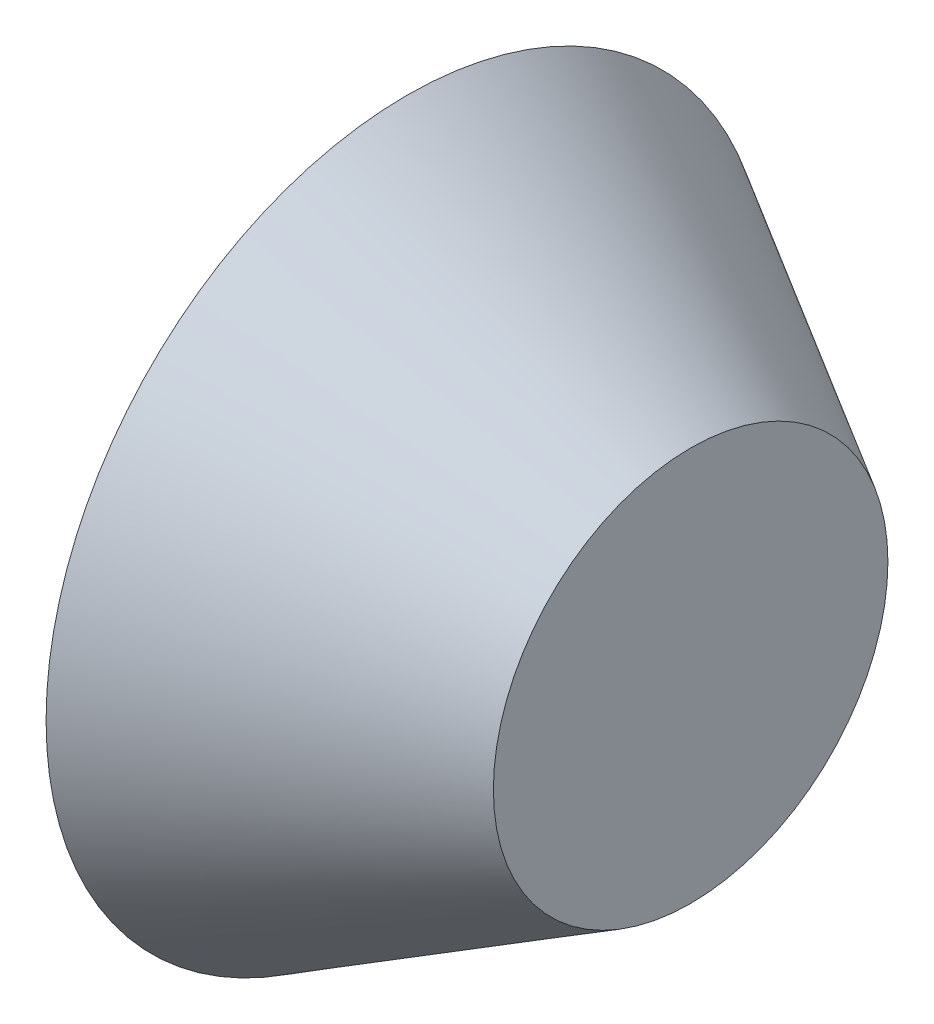
ISO-10303-21;
HEADER;
FILE_DESCRIPTION(('STEP AP214'),'2;1');
FILE_NAME('part.step','',(''),(''),'','','');
FILE_SCHEMA(('AUTOMOTIVE_DESIGN { 1 0 10303 214 1 1 1 1 }'));
ENDSEC;
DATA;
#1=APPLICATION_CONTEXT('core data for automotive mechanical design processes');
#2=APPLICATION_PROTOCOL_DEFINITION('international standard','automotive_design',2000,#1);
#3=PRODUCT_CONTEXT('',#1,'mechanical');
#4=PRODUCT('Part','Part','',(#3));
#5=PRODUCT_RELATED_PRODUCT_CATEGORY('part','',(#4));
#6=PRODUCT_DEFINITION_FORMATION('','',#4);
#7=PRODUCT_DEFINITION_CONTEXT('part definition',#1,'design');
#8=PRODUCT_DEFINITION('design','',#6,#7);
#9=PRODUCT_DEFINITION_SHAPE('','',#8);
#10=(LENGTH_UNIT() NAMED_UNIT(*) SI_UNIT(.MILLI.,.METRE.));
#11=(NAMED_UNIT(*) PLANE_ANGLE_UNIT() SI_UNIT($,.RADIAN.));
#12=(NAMED_UNIT(*) SI_UNIT($,.STERADIAN.) SOLID_ANGLE_UNIT());
#13=UNCERTAINTY_MEASURE_WITH_UNIT(LENGTH_MEASURE(1.E-05),#10,'distance_accuracy_value','');
#14=(GEOMETRIC_REPRESENTATION_CONTEXT(3) GLOBAL_UNCERTAINTY_ASSIGNED_CONTEXT((#13)) GLOBAL_UNIT_ASSIGNED_CONTEXT((#10,
#11,#12)) REPRESENTATION_CONTEXT('',''));
#15=CARTESIAN_POINT('',(0.,0.,0.));
#16=DIRECTION('',(0.,0.,1.));
#17=DIRECTION('',(1.,0.,0.));
#18=AXIS2_PLACEMENT_3D('',#15,#16,#17);
#19=CARTESIAN_POINT('',(0.110433477200222,11.1754264805429,0.));
#20=DIRECTION('',(1.,0.,0.));
#21=DIRECTION('',(0.,0.,-1.));
#22=AXIS2_PLACEMENT_3D('',#19,#20,#21);
#23=PLANE('',#22);
#24=CARTESIAN_POINT('',(0.11043347720022,0.,0.));
#25=DIRECTION('',(-1.,0.,0.));
#26=DIRECTION('',(0.,0.,1.));
#27=AXIS2_PLACEMENT_3D('',#24,#25,#26);
#28=CIRCLE('',#27,11.1754264805429);
#29=CARTESIAN_POINT('',(0.11043347720022,0.,11.1754264805429));
#30=VERTEX_POINT('',#29);
#31=EDGE_CURVE('E10',#30,#30,#28,.T.);
#32=ORIENTED_EDGE('',*,*,#31,.F.);
#33=EDGE_LOOP('',(#32));
#34=FACE_BOUND('',#33,.T.);
#35=CARTESIAN_POINT('',(0.11043347720022,0.,0.));
#36=DIRECTION('',(-1.,0.,0.));
#37=DIRECTION('',(0.,0.,1.));
#38=AXIS2_PLACEMENT_3D('',#35,#36,#37);
#39=CIRCLE('',#38,14.6395280956806);
#40=CARTESIAN_POINT('',(0.11043347720022,0.,14.6395280956806));
#41=VERTEX_POINT('',#40);
#42=EDGE_CURVE('E54',#41,#41,#39,.T.);
#43=ORIENTED_EDGE('',*,*,#42,.T.);
#44=EDGE_LOOP('',(#43));
#45=FACE_BOUND('',#44,.T.);
#46=ADVANCED_FACE('F37',(#34,#45),#23,.F.);
#47=CARTESIAN_POINT('',(0.11043347720022,0.,0.));
#48=DIRECTION('',(-1.,0.,0.));
#49=DIRECTION('',(0.,0.,1.));
#50=AXIS2_PLACEMENT_3D('',#47,#48,#49);
#51=CONICAL_SURFACE('',#50,11.1754264805429,0.523598775598292);
#52=CARTESIAN_POINT('',(8.61043347720022,0.,0.));
#53=DIRECTION('',(-1.,0.,0.));
#54=DIRECTION('',(0.,0.,1.));
#55=AXIS2_PLACEMENT_3D('',#52,#53,#54);
#56=CIRCLE('',#55,6.26794919243111);
#57=CARTESIAN_POINT('',(8.61043347720022,0.,6.26794919243111));
#58=VERTEX_POINT('',#57);
#59=EDGE_CURVE('E44',#58,#58,#56,.T.);
#60=ORIENTED_EDGE('',*,*,#59,.F.);
#61=EDGE_LOOP('',(#60));
#62=FACE_BOUND('',#61,.T.);
#63=ORIENTED_EDGE('',*,*,#31,.T.);
#64=EDGE_LOOP('',(#63));
#65=FACE_BOUND('',#64,.T.);
#66=ADVANCED_FACE('F75',(#62,#65),#51,.F.);
#67=CARTESIAN_POINT('',(8.61043347720022,0.,0.));
#68=DIRECTION('',(1.,0.,0.));
#69=DIRECTION('',(0.,0.,-1.));
#70=AXIS2_PLACEMENT_3D('',#67,#68,#69);
#71=PLANE('',#70);
#72=ORIENTED_EDGE('',*,*,#59,.T.);
#73=EDGE_LOOP('',(#72));
#74=FACE_BOUND('',#73,.T.);
#75=ADVANCED_FACE('F70',(#74),#71,.F.);
#76=CARTESIAN_POINT('',(11.6104334772002,8.,0.));
#77=DIRECTION('',(-1.,0.,0.));
#78=DIRECTION('',(0.,0.,1.));
#79=AXIS2_PLACEMENT_3D('',#76,#77,#78);
#80=PLANE('',#79);
#81=CARTESIAN_POINT('',(11.6104334772002,0.,0.));
#82=DIRECTION('',(-1.,0.,0.));
#83=DIRECTION('',(0.,0.,1.));
#84=AXIS2_PLACEMENT_3D('',#81,#82,#83);
#85=CIRCLE('',#84,8.);
#86=CARTESIAN_POINT('',(11.6104334772002,0.,8.));
#87=VERTEX_POINT('',#86);
#88=EDGE_CURVE('E49',#87,#87,#85,.T.);
#89=ORIENTED_EDGE('',*,*,#88,.F.);
#90=EDGE_LOOP('',(#89));
#91=FACE_BOUND('',#90,.T.);
#92=ADVANCED_FACE('F65',(#91),#80,.F.);
#93=CARTESIAN_POINT('',(11.6104334772002,0.,0.));
#94=DIRECTION('',(-1.,0.,0.));
#95=DIRECTION('',(0.,0.,1.));
#96=AXIS2_PLACEMENT_3D('',#93,#94,#95);
#97=CONICAL_SURFACE('',#96,8.,0.523598775598292);
#98=ORIENTED_EDGE('',*,*,#42,.F.);
#99=EDGE_LOOP('',(#98));
#100=FACE_BOUND('',#99,.T.);
#101=ORIENTED_EDGE('',*,*,#88,.T.);
#102=EDGE_LOOP('',(#101));
#103=FACE_BOUND('',#102,.T.);
#104=ADVANCED_FACE('F62',(#100,#103),#97,.T.);
#105=CLOSED_SHELL('',(#46,#66,#75,#92,#104));
#106=MANIFOLD_SOLID_BREP('B2',#105);
#107=ADVANCED_BREP_SHAPE_REPRESENTATION('',(#18,#106),#14);
#108=SHAPE_DEFINITION_REPRESENTATION(#9,#107);
ENDSEC;
END-ISO-10303-21;
